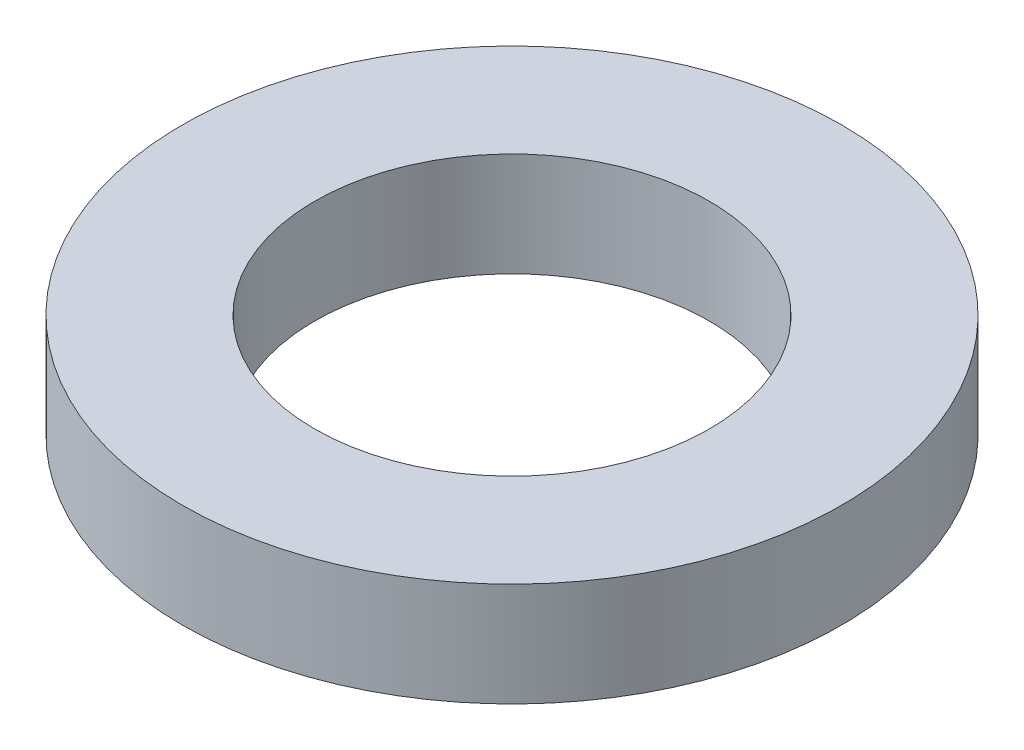
ISO-10303-21;
HEADER;
FILE_DESCRIPTION(('STEP AP214'),'2;1');
FILE_NAME('part.step','',(''),(''),'','','');
FILE_SCHEMA(('AUTOMOTIVE_DESIGN { 1 0 10303 214 1 1 1 1 }'));
ENDSEC;
DATA;
#1=APPLICATION_CONTEXT('core data for automotive mechanical design processes');
#2=APPLICATION_PROTOCOL_DEFINITION('international standard','automotive_design',2000,#1);
#3=PRODUCT_CONTEXT('',#1,'mechanical');
#4=PRODUCT('Part','Part','',(#3));
#5=PRODUCT_RELATED_PRODUCT_CATEGORY('part','',(#4));
#6=PRODUCT_DEFINITION_FORMATION('','',#4);
#7=PRODUCT_DEFINITION_CONTEXT('part definition',#1,'design');
#8=PRODUCT_DEFINITION('design','',#6,#7);
#9=PRODUCT_DEFINITION_SHAPE('','',#8);
#10=(LENGTH_UNIT() NAMED_UNIT(*) SI_UNIT(.MILLI.,.METRE.));
#11=(NAMED_UNIT(*) PLANE_ANGLE_UNIT() SI_UNIT($,.RADIAN.));
#12=(NAMED_UNIT(*) SI_UNIT($,.STERADIAN.) SOLID_ANGLE_UNIT());
#13=UNCERTAINTY_MEASURE_WITH_UNIT(LENGTH_MEASURE(1.E-05),#10,'distance_accuracy_value','');
#14=(GEOMETRIC_REPRESENTATION_CONTEXT(3) GLOBAL_UNCERTAINTY_ASSIGNED_CONTEXT((#13)) GLOBAL_UNIT_ASSIGNED_CONTEXT((#10,
#11,#12)) REPRESENTATION_CONTEXT('',''));
#15=CARTESIAN_POINT('',(0.,0.,0.));
#16=DIRECTION('',(0.,0.,1.));
#17=DIRECTION('',(1.,0.,0.));
#18=AXIS2_PLACEMENT_3D('',#15,#16,#17);
#19=CARTESIAN_POINT('',(0.,2.,0.));
#20=DIRECTION('',(0.,1.,0.));
#21=DIRECTION('',(0.,0.,1.));
#22=AXIS2_PLACEMENT_3D('',#19,#20,#21);
#23=PLANE('',#22);
#24=CARTESIAN_POINT('',(0.,2.,0.));
#25=DIRECTION('',(0.,1.,0.));
#26=DIRECTION('',(0.,0.,1.));
#27=AXIS2_PLACEMENT_3D('',#24,#25,#26);
#28=CIRCLE('',#27,6.35);
#29=CARTESIAN_POINT('',(0.,2.,6.35));
#30=VERTEX_POINT('',#29);
#31=EDGE_CURVE('E10',#30,#30,#28,.T.);
#32=ORIENTED_EDGE('',*,*,#31,.T.);
#33=EDGE_LOOP('',(#32));
#34=FACE_BOUND('',#33,.T.);
#35=CARTESIAN_POINT('',(0.,2.,0.));
#36=DIRECTION('',(0.,1.,0.));
#37=DIRECTION('',(0.,0.,1.));
#38=AXIS2_PLACEMENT_3D('',#35,#36,#37);
#39=CIRCLE('',#38,3.802);
#40=CARTESIAN_POINT('',(0.,2.,3.802));
#41=VERTEX_POINT('',#40);
#42=EDGE_CURVE('E50',#41,#41,#39,.T.);
#43=ORIENTED_EDGE('',*,*,#42,.F.);
#44=EDGE_LOOP('',(#43));
#45=FACE_BOUND('',#44,.T.);
#46=ADVANCED_FACE('F37',(#34,#45),#23,.T.);
#47=CARTESIAN_POINT('',(0.,0.,0.));
#48=DIRECTION('',(0.,1.,0.));
#49=DIRECTION('',(0.,0.,1.));
#50=AXIS2_PLACEMENT_3D('',#47,#48,#49);
#51=PLANE('',#50);
#52=CARTESIAN_POINT('',(0.,0.,0.));
#53=DIRECTION('',(0.,1.,0.));
#54=DIRECTION('',(0.,0.,1.));
#55=AXIS2_PLACEMENT_3D('',#52,#53,#54);
#56=CIRCLE('',#55,6.35);
#57=CARTESIAN_POINT('',(0.,0.,6.35));
#58=VERTEX_POINT('',#57);
#59=EDGE_CURVE('E41',#58,#58,#56,.T.);
#60=ORIENTED_EDGE('',*,*,#59,.F.);
#61=EDGE_LOOP('',(#60));
#62=FACE_BOUND('',#61,.T.);
#63=CARTESIAN_POINT('',(0.,0.,0.));
#64=DIRECTION('',(0.,1.,0.));
#65=DIRECTION('',(0.,0.,1.));
#66=AXIS2_PLACEMENT_3D('',#63,#64,#65);
#67=CIRCLE('',#66,3.802);
#68=CARTESIAN_POINT('',(0.,0.,3.802));
#69=VERTEX_POINT('',#68);
#70=EDGE_CURVE('E52',#69,#69,#67,.T.);
#71=ORIENTED_EDGE('',*,*,#70,.T.);
#72=EDGE_LOOP('',(#71));
#73=FACE_BOUND('',#72,.T.);
#74=ADVANCED_FACE('F64',(#62,#73),#51,.F.);
#75=CARTESIAN_POINT('',(0.,2.,0.));
#76=DIRECTION('',(0.,-1.,0.));
#77=DIRECTION('',(0.,0.,-1.));
#78=AXIS2_PLACEMENT_3D('',#75,#76,#77);
#79=CYLINDRICAL_SURFACE('',#78,6.35);
#80=ORIENTED_EDGE('',*,*,#31,.F.);
#81=EDGE_LOOP('',(#80));
#82=FACE_BOUND('',#81,.T.);
#83=ORIENTED_EDGE('',*,*,#59,.T.);
#84=EDGE_LOOP('',(#83));
#85=FACE_BOUND('',#84,.T.);
#86=ADVANCED_FACE('F39',(#82,#85),#79,.T.);
#87=CARTESIAN_POINT('',(0.,2.,0.));
#88=DIRECTION('',(0.,-1.,0.));
#89=DIRECTION('',(0.,0.,-1.));
#90=AXIS2_PLACEMENT_3D('',#87,#88,#89);
#91=CYLINDRICAL_SURFACE('',#90,3.802);
#92=ORIENTED_EDGE('',*,*,#42,.T.);
#93=EDGE_LOOP('',(#92));
#94=FACE_BOUND('',#93,.T.);
#95=ORIENTED_EDGE('',*,*,#70,.F.);
#96=EDGE_LOOP('',(#95));
#97=FACE_BOUND('',#96,.T.);
#98=ADVANCED_FACE('F60',(#94,#97),#91,.F.);
#99=CLOSED_SHELL('',(#46,#74,#86,#98));
#100=MANIFOLD_SOLID_BREP('B2',#99);
#101=ADVANCED_BREP_SHAPE_REPRESENTATION('',(#18,#100),#14);
#102=SHAPE_DEFINITION_REPRESENTATION(#9,#101);
ENDSEC;
END-ISO-10303-21;
